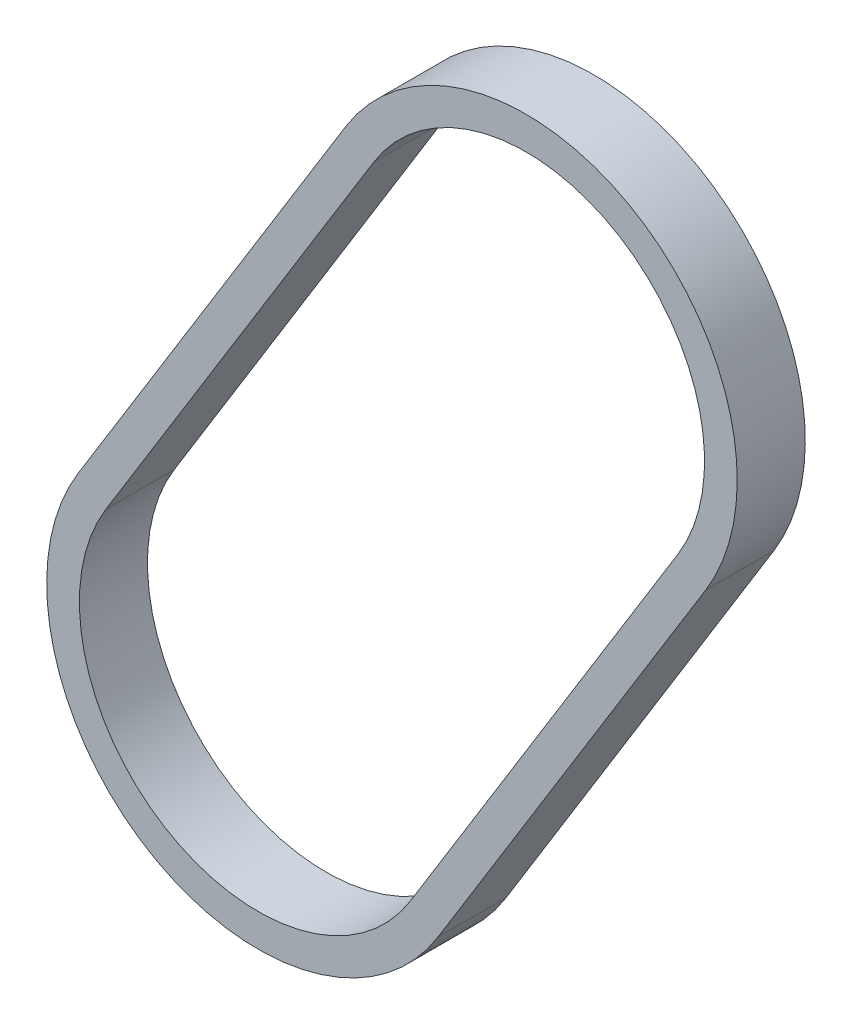
ISO-10303-21;
HEADER;
FILE_DESCRIPTION(('STEP AP214'),'2;1');
FILE_NAME('part.step','',(''),(''),'','','');
FILE_SCHEMA(('AUTOMOTIVE_DESIGN { 1 0 10303 214 1 1 1 1 }'));
ENDSEC;
DATA;
#1=APPLICATION_CONTEXT('core data for automotive mechanical design processes');
#2=APPLICATION_PROTOCOL_DEFINITION('international standard','automotive_design',2000,#1);
#3=PRODUCT_CONTEXT('',#1,'mechanical');
#4=PRODUCT('Part','Part','',(#3));
#5=PRODUCT_RELATED_PRODUCT_CATEGORY('part','',(#4));
#6=PRODUCT_DEFINITION_FORMATION('','',#4);
#7=PRODUCT_DEFINITION_CONTEXT('part definition',#1,'design');
#8=PRODUCT_DEFINITION('design','',#6,#7);
#9=PRODUCT_DEFINITION_SHAPE('','',#8);
#10=(LENGTH_UNIT() NAMED_UNIT(*) SI_UNIT(.MILLI.,.METRE.));
#11=(NAMED_UNIT(*) PLANE_ANGLE_UNIT() SI_UNIT($,.RADIAN.));
#12=(NAMED_UNIT(*) SI_UNIT($,.STERADIAN.) SOLID_ANGLE_UNIT());
#13=UNCERTAINTY_MEASURE_WITH_UNIT(LENGTH_MEASURE(1.E-05),#10,'distance_accuracy_value','');
#14=(GEOMETRIC_REPRESENTATION_CONTEXT(3) GLOBAL_UNCERTAINTY_ASSIGNED_CONTEXT((#13)) GLOBAL_UNIT_ASSIGNED_CONTEXT((#10,
#11,#12)) REPRESENTATION_CONTEXT('',''));
#15=CARTESIAN_POINT('',(0.,0.,0.));
#16=DIRECTION('',(0.,0.,1.));
#17=DIRECTION('',(1.,0.,0.));
#18=AXIS2_PLACEMENT_3D('',#15,#16,#17);
#19=CARTESIAN_POINT('',(19.6769306046289,31.9228507809158,-5.));
#20=DIRECTION('',(0.,0.,1.));
#21=DIRECTION('',(1.,0.,0.));
#22=AXIS2_PLACEMENT_3D('',#19,#20,#21);
#23=CYLINDRICAL_SURFACE('',#22,15.5239448782706);
#24=CARTESIAN_POINT('',(19.6769306046289,31.9228507809158,0.));
#25=DIRECTION('',(0.,0.,-1.));
#26=DIRECTION('',(-1.,0.,0.));
#27=AXIS2_PLACEMENT_3D('',#24,#25,#26);
#28=CIRCLE('',#27,15.5239448782706);
#29=CARTESIAN_POINT('',(32.8920926281008,23.7771551521207,0.));
#30=VERTEX_POINT('',#29);
#31=CARTESIAN_POINT('',(6.46176858115711,40.0685464097109,0.));
#32=VERTEX_POINT('',#31);
#33=EDGE_CURVE('E157',#30,#32,#28,.F.);
#34=ORIENTED_EDGE('',*,*,#33,.F.);
#35=DIRECTION('',(0.,0.,1.));
#36=VECTOR('',#35,1.);
#37=CARTESIAN_POINT('',(32.8920926281008,23.7771551521207,-5.));
#38=LINE('',#37,#36);
#39=CARTESIAN_POINT('',(32.8920926281008,23.7771551521207,-5.));
#40=VERTEX_POINT('',#39);
#41=EDGE_CURVE('E12',#40,#30,#38,.T.);
#42=ORIENTED_EDGE('',*,*,#41,.F.);
#43=CARTESIAN_POINT('',(19.6769306046289,31.9228507809158,-5.));
#44=DIRECTION('',(0.,0.,-1.));
#45=DIRECTION('',(-1.,0.,0.));
#46=AXIS2_PLACEMENT_3D('',#43,#44,#45);
#47=CIRCLE('',#46,15.5239448782706);
#48=CARTESIAN_POINT('',(6.46176858115711,40.0685464097109,-5.));
#49=VERTEX_POINT('',#48);
#50=EDGE_CURVE('E161',#40,#49,#47,.F.);
#51=ORIENTED_EDGE('',*,*,#50,.T.);
#52=DIRECTION('',(0.,0.,1.));
#53=VECTOR('',#52,1.);
#54=CARTESIAN_POINT('',(6.46176858115711,40.0685464097109,-5.));
#55=LINE('',#54,#53);
#56=EDGE_CURVE('E62',#49,#32,#55,.T.);
#57=ORIENTED_EDGE('',*,*,#56,.T.);
#58=EDGE_LOOP('',(#34,#42,#51,#57));
#59=FACE_BOUND('',#58,.T.);
#60=ADVANCED_FACE('F59',(#59),#23,.T.);
#61=CARTESIAN_POINT('',(32.8920926281008,23.7771551521207,-5.));
#62=DIRECTION('',(0.851276020824421,-0.524718149456772,0.));
#63=DIRECTION('',(0.524718149456772,0.851276020824421,0.));
#64=AXIS2_PLACEMENT_3D('',#61,#62,#63);
#65=PLANE('',#64);
#66=DIRECTION('',(0.524718149456772,0.851276020824421,0.));
#67=VECTOR('',#66,1.);
#68=CARTESIAN_POINT('',(32.8920926281008,23.7771551521207,0.));
#69=LINE('',#68,#67);
#70=CARTESIAN_POINT('',(13.2151620234718,-8.14569562879506,0.));
#71=VERTEX_POINT('',#70);
#72=EDGE_CURVE('E165',#71,#30,#69,.T.);
#73=ORIENTED_EDGE('',*,*,#72,.F.);
#74=DIRECTION('',(0.,0.,1.));
#75=VECTOR('',#74,1.);
#76=CARTESIAN_POINT('',(13.2151620234718,-8.14569562879506,-5.));
#77=LINE('',#76,#75);
#78=CARTESIAN_POINT('',(13.2151620234718,-8.14569562879506,-5.));
#79=VERTEX_POINT('',#78);
#80=EDGE_CURVE('E67',#79,#71,#77,.T.);
#81=ORIENTED_EDGE('',*,*,#80,.F.);
#82=DIRECTION('',(0.524718149456772,0.851276020824421,0.));
#83=VECTOR('',#82,1.);
#84=CARTESIAN_POINT('',(32.8920926281008,23.7771551521207,-5.));
#85=LINE('',#84,#83);
#86=EDGE_CURVE('E171',#79,#40,#85,.T.);
#87=ORIENTED_EDGE('',*,*,#86,.T.);
#88=ORIENTED_EDGE('',*,*,#41,.T.);
#89=EDGE_LOOP('',(#73,#81,#87,#88));
#90=FACE_BOUND('',#89,.T.);
#91=ADVANCED_FACE('F197',(#90),#65,.T.);
#92=CARTESIAN_POINT('',(0.,0.,-5.));
#93=DIRECTION('',(0.,0.,1.));
#94=DIRECTION('',(1.,0.,0.));
#95=AXIS2_PLACEMENT_3D('',#92,#93,#94);
#96=CYLINDRICAL_SURFACE('',#95,15.5239448782706);
#97=CARTESIAN_POINT('',(0.,0.,0.));
#98=DIRECTION('',(0.,0.,-1.));
#99=DIRECTION('',(-1.,0.,0.));
#100=AXIS2_PLACEMENT_3D('',#97,#98,#99);
#101=CIRCLE('',#100,15.5239448782706);
#102=CARTESIAN_POINT('',(-13.2151620234718,8.14569562879507,0.));
#103=VERTEX_POINT('',#102);
#104=EDGE_CURVE('E179',#103,#71,#101,.F.);
#105=ORIENTED_EDGE('',*,*,#104,.F.);
#106=DIRECTION('',(0.,0.,1.));
#107=VECTOR('',#106,1.);
#108=CARTESIAN_POINT('',(-13.2151620234718,8.14569562879507,-5.));
#109=LINE('',#108,#107);
#110=CARTESIAN_POINT('',(-13.2151620234718,8.14569562879507,-5.));
#111=VERTEX_POINT('',#110);
#112=EDGE_CURVE('E184',#111,#103,#109,.T.);
#113=ORIENTED_EDGE('',*,*,#112,.F.);
#114=CARTESIAN_POINT('',(0.,0.,-5.));
#115=DIRECTION('',(0.,0.,-1.));
#116=DIRECTION('',(-1.,0.,0.));
#117=AXIS2_PLACEMENT_3D('',#114,#115,#116);
#118=CIRCLE('',#117,15.5239448782706);
#119=EDGE_CURVE('E168',#111,#79,#118,.F.);
#120=ORIENTED_EDGE('',*,*,#119,.T.);
#121=ORIENTED_EDGE('',*,*,#80,.T.);
#122=EDGE_LOOP('',(#105,#113,#120,#121));
#123=FACE_BOUND('',#122,.T.);
#124=ADVANCED_FACE('F201',(#123),#96,.T.);
#125=CARTESIAN_POINT('',(6.46176858115711,40.0685464097109,-5.));
#126=DIRECTION('',(-0.851276020824421,0.524718149456772,0.));
#127=DIRECTION('',(-0.524718149456772,-0.851276020824421,0.));
#128=AXIS2_PLACEMENT_3D('',#125,#126,#127);
#129=PLANE('',#128);
#130=DIRECTION('',(-0.524718149456772,-0.851276020824421,0.));
#131=VECTOR('',#130,1.);
#132=CARTESIAN_POINT('',(6.46176858115711,40.0685464097109,0.));
#133=LINE('',#132,#131);
#134=EDGE_CURVE('E176',#32,#103,#133,.T.);
#135=ORIENTED_EDGE('',*,*,#134,.F.);
#136=ORIENTED_EDGE('',*,*,#56,.F.);
#137=DIRECTION('',(-0.524718149456772,-0.851276020824421,0.));
#138=VECTOR('',#137,1.);
#139=CARTESIAN_POINT('',(6.46176858115711,40.0685464097109,-5.));
#140=LINE('',#139,#138);
#141=EDGE_CURVE('E164',#49,#111,#140,.T.);
#142=ORIENTED_EDGE('',*,*,#141,.T.);
#143=ORIENTED_EDGE('',*,*,#112,.T.);
#144=EDGE_LOOP('',(#135,#136,#142,#143));
#145=FACE_BOUND('',#144,.T.);
#146=ADVANCED_FACE('F192',(#145),#129,.T.);
#147=CARTESIAN_POINT('',(19.6769306046289,31.9228507809158,-5.));
#148=DIRECTION('',(0.,0.,-1.));
#149=DIRECTION('',(-1.,0.,0.));
#150=AXIS2_PLACEMENT_3D('',#147,#148,#149);
#151=PLANE('',#150);
#152=CARTESIAN_POINT('',(19.6769306046289,31.9228507809158,-5.));
#153=DIRECTION('',(0.,0.,-1.));
#154=DIRECTION('',(-1.,0.,0.));
#155=AXIS2_PLACEMENT_3D('',#152,#153,#154);
#156=CIRCLE('',#155,13.1239448782706);
#157=CARTESIAN_POINT('',(30.8490301781222,25.036478710817,-5.));
#158=VERTEX_POINT('',#157);
#159=CARTESIAN_POINT('',(8.50483103113572,38.8092228510146,-5.));
#160=VERTEX_POINT('',#159);
#161=EDGE_CURVE('E126',#158,#160,#156,.F.);
#162=ORIENTED_EDGE('',*,*,#161,.T.);
#163=DIRECTION('',(-0.524718149456772,-0.851276020824421,0.));
#164=VECTOR('',#163,1.);
#165=CARTESIAN_POINT('',(8.50483103113572,38.8092228510146,-5.));
#166=LINE('',#165,#164);
#167=CARTESIAN_POINT('',(-11.1720995734932,6.88637207009882,-5.));
#168=VERTEX_POINT('',#167);
#169=EDGE_CURVE('E135',#160,#168,#166,.T.);
#170=ORIENTED_EDGE('',*,*,#169,.T.);
#171=CARTESIAN_POINT('',(0.,0.,-5.));
#172=DIRECTION('',(0.,0.,-1.));
#173=DIRECTION('',(-1.,0.,0.));
#174=AXIS2_PLACEMENT_3D('',#171,#172,#173);
#175=CIRCLE('',#174,13.1239448782706);
#176=CARTESIAN_POINT('',(11.1720995734932,-6.88637207009881,-5.));
#177=VERTEX_POINT('',#176);
#178=EDGE_CURVE('E75',#168,#177,#175,.F.);
#179=ORIENTED_EDGE('',*,*,#178,.T.);
#180=DIRECTION('',(0.524718149456772,0.851276020824421,0.));
#181=VECTOR('',#180,1.);
#182=CARTESIAN_POINT('',(30.8490301781222,25.036478710817,-5.));
#183=LINE('',#182,#181);
#184=EDGE_CURVE('E132',#177,#158,#183,.T.);
#185=ORIENTED_EDGE('',*,*,#184,.T.);
#186=EDGE_LOOP('',(#162,#170,#179,#185));
#187=FACE_BOUND('',#186,.T.);
#188=ORIENTED_EDGE('',*,*,#50,.F.);
#189=ORIENTED_EDGE('',*,*,#86,.F.);
#190=ORIENTED_EDGE('',*,*,#119,.F.);
#191=ORIENTED_EDGE('',*,*,#141,.F.);
#192=EDGE_LOOP('',(#188,#189,#190,#191));
#193=FACE_BOUND('',#192,.T.);
#194=ADVANCED_FACE('F139',(#187,#193),#151,.T.);
#195=CARTESIAN_POINT('',(19.6769306046289,31.9228507809158,0.));
#196=DIRECTION('',(0.,0.,-1.));
#197=DIRECTION('',(-1.,0.,0.));
#198=AXIS2_PLACEMENT_3D('',#195,#196,#197);
#199=PLANE('',#198);
#200=DIRECTION('',(-0.524718149456772,-0.851276020824421,0.));
#201=VECTOR('',#200,1.);
#202=CARTESIAN_POINT('',(8.50483103113572,38.8092228510146,0.));
#203=LINE('',#202,#201);
#204=CARTESIAN_POINT('',(8.50483103113573,38.8092228510146,0.));
#205=VERTEX_POINT('',#204);
#206=CARTESIAN_POINT('',(-11.1720995734932,6.88637207009882,0.));
#207=VERTEX_POINT('',#206);
#208=EDGE_CURVE('E151',#205,#207,#203,.T.);
#209=ORIENTED_EDGE('',*,*,#208,.F.);
#210=CARTESIAN_POINT('',(19.6769306046289,31.9228507809158,0.));
#211=DIRECTION('',(0.,0.,-1.));
#212=DIRECTION('',(-1.,0.,0.));
#213=AXIS2_PLACEMENT_3D('',#210,#211,#212);
#214=CIRCLE('',#213,13.1239448782706);
#215=CARTESIAN_POINT('',(30.8490301781222,25.036478710817,0.));
#216=VERTEX_POINT('',#215);
#217=EDGE_CURVE('E83',#216,#205,#214,.F.);
#218=ORIENTED_EDGE('',*,*,#217,.F.);
#219=DIRECTION('',(0.524718149456772,0.851276020824421,0.));
#220=VECTOR('',#219,1.);
#221=CARTESIAN_POINT('',(30.8490301781222,25.036478710817,0.));
#222=LINE('',#221,#220);
#223=CARTESIAN_POINT('',(11.1720995734932,-6.88637207009881,0.));
#224=VERTEX_POINT('',#223);
#225=EDGE_CURVE('E142',#224,#216,#222,.T.);
#226=ORIENTED_EDGE('',*,*,#225,.F.);
#227=CARTESIAN_POINT('',(0.,0.,0.));
#228=DIRECTION('',(0.,0.,-1.));
#229=DIRECTION('',(-1.,0.,0.));
#230=AXIS2_PLACEMENT_3D('',#227,#228,#229);
#231=CIRCLE('',#230,13.1239448782706);
#232=EDGE_CURVE('E145',#207,#224,#231,.F.);
#233=ORIENTED_EDGE('',*,*,#232,.F.);
#234=EDGE_LOOP('',(#209,#218,#226,#233));
#235=FACE_BOUND('',#234,.T.);
#236=ORIENTED_EDGE('',*,*,#33,.T.);
#237=ORIENTED_EDGE('',*,*,#134,.T.);
#238=ORIENTED_EDGE('',*,*,#104,.T.);
#239=ORIENTED_EDGE('',*,*,#72,.T.);
#240=EDGE_LOOP('',(#236,#237,#238,#239));
#241=FACE_BOUND('',#240,.T.);
#242=ADVANCED_FACE('F194',(#235,#241),#199,.F.);
#243=CARTESIAN_POINT('',(19.6769306046289,31.9228507809158,-5.));
#244=DIRECTION('',(0.,0.,1.));
#245=DIRECTION('',(1.,0.,0.));
#246=AXIS2_PLACEMENT_3D('',#243,#244,#245);
#247=CYLINDRICAL_SURFACE('',#246,13.1239448782706);
#248=ORIENTED_EDGE('',*,*,#217,.T.);
#249=DIRECTION('',(0.,0.,1.));
#250=VECTOR('',#249,1.);
#251=CARTESIAN_POINT('',(8.50483103113572,38.8092228510146,-5.));
#252=LINE('',#251,#250);
#253=EDGE_CURVE('E122',#160,#205,#252,.T.);
#254=ORIENTED_EDGE('',*,*,#253,.F.);
#255=ORIENTED_EDGE('',*,*,#161,.F.);
#256=DIRECTION('',(0.,0.,1.));
#257=VECTOR('',#256,1.);
#258=CARTESIAN_POINT('',(30.8490301781222,25.036478710817,-5.));
#259=LINE('',#258,#257);
#260=EDGE_CURVE('E155',#158,#216,#259,.T.);
#261=ORIENTED_EDGE('',*,*,#260,.T.);
#262=EDGE_LOOP('',(#248,#254,#255,#261));
#263=FACE_BOUND('',#262,.T.);
#264=ADVANCED_FACE('F124',(#263),#247,.F.);
#265=CARTESIAN_POINT('',(30.8490301781222,25.036478710817,-5.));
#266=DIRECTION('',(0.851276020824421,-0.524718149456772,0.));
#267=DIRECTION('',(0.524718149456772,0.851276020824421,0.));
#268=AXIS2_PLACEMENT_3D('',#265,#266,#267);
#269=PLANE('',#268);
#270=ORIENTED_EDGE('',*,*,#225,.T.);
#271=ORIENTED_EDGE('',*,*,#260,.F.);
#272=ORIENTED_EDGE('',*,*,#184,.F.);
#273=DIRECTION('',(0.,0.,1.));
#274=VECTOR('',#273,1.);
#275=CARTESIAN_POINT('',(11.1720995734932,-6.88637207009881,-5.));
#276=LINE('',#275,#274);
#277=EDGE_CURVE('E158',#177,#224,#276,.T.);
#278=ORIENTED_EDGE('',*,*,#277,.T.);
#279=EDGE_LOOP('',(#270,#271,#272,#278));
#280=FACE_BOUND('',#279,.T.);
#281=ADVANCED_FACE('F252',(#280),#269,.F.);
#282=CARTESIAN_POINT('',(0.,0.,-5.));
#283=DIRECTION('',(0.,0.,1.));
#284=DIRECTION('',(1.,0.,0.));
#285=AXIS2_PLACEMENT_3D('',#282,#283,#284);
#286=CYLINDRICAL_SURFACE('',#285,13.1239448782706);
#287=ORIENTED_EDGE('',*,*,#232,.T.);
#288=ORIENTED_EDGE('',*,*,#277,.F.);
#289=ORIENTED_EDGE('',*,*,#178,.F.);
#290=DIRECTION('',(0.,0.,1.));
#291=VECTOR('',#290,1.);
#292=CARTESIAN_POINT('',(-11.1720995734932,6.88637207009882,-5.));
#293=LINE('',#292,#291);
#294=EDGE_CURVE('E131',#168,#207,#293,.T.);
#295=ORIENTED_EDGE('',*,*,#294,.T.);
#296=EDGE_LOOP('',(#287,#288,#289,#295));
#297=FACE_BOUND('',#296,.T.);
#298=ADVANCED_FACE('F261',(#297),#286,.F.);
#299=CARTESIAN_POINT('',(8.50483103113572,38.8092228510146,-5.));
#300=DIRECTION('',(-0.851276020824421,0.524718149456772,0.));
#301=DIRECTION('',(-0.524718149456772,-0.851276020824421,0.));
#302=AXIS2_PLACEMENT_3D('',#299,#300,#301);
#303=PLANE('',#302);
#304=ORIENTED_EDGE('',*,*,#208,.T.);
#305=ORIENTED_EDGE('',*,*,#294,.F.);
#306=ORIENTED_EDGE('',*,*,#169,.F.);
#307=ORIENTED_EDGE('',*,*,#253,.T.);
#308=EDGE_LOOP('',(#304,#305,#306,#307));
#309=FACE_BOUND('',#308,.T.);
#310=ADVANCED_FACE('F136',(#309),#303,.F.);
#311=CLOSED_SHELL('',(#60,#91,#124,#146,#194,#242,#264,#281,#298,#310));
#312=MANIFOLD_SOLID_BREP('B2',#311);
#313=ADVANCED_BREP_SHAPE_REPRESENTATION('',(#18,#312),#14);
#314=SHAPE_DEFINITION_REPRESENTATION(#9,#313);
ENDSEC;
END-ISO-10303-21;
